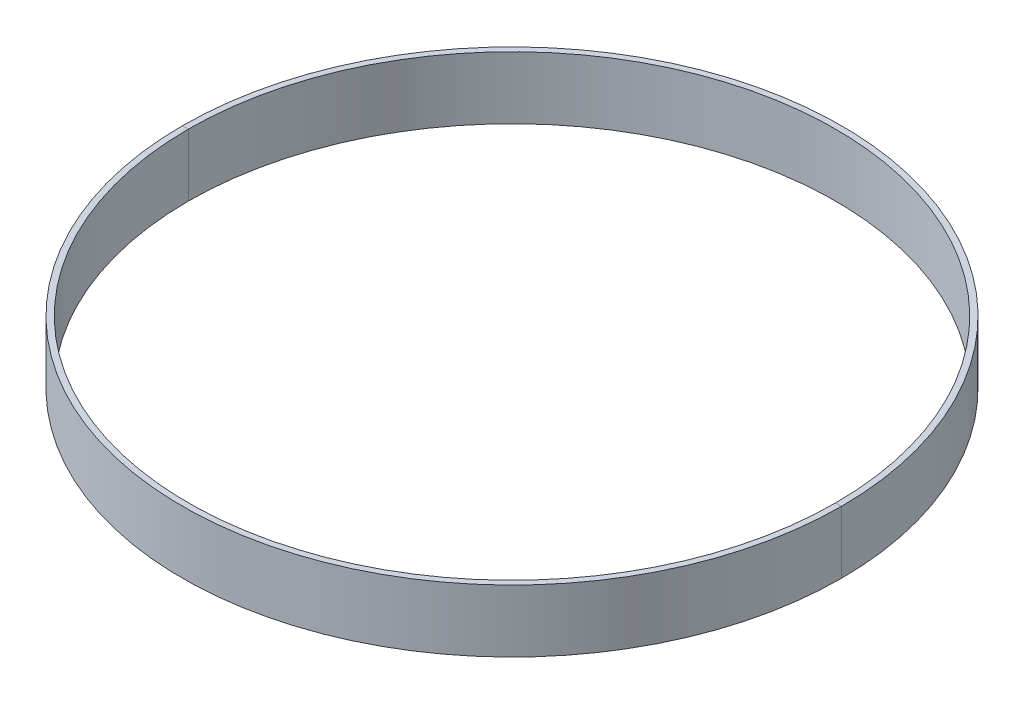
ISO-10303-21;
HEADER;
FILE_DESCRIPTION(('STEP AP214'),'2;1');
FILE_NAME('part.step','',(''),(''),'','','');
FILE_SCHEMA(('AUTOMOTIVE_DESIGN { 1 0 10303 214 1 1 1 1 }'));
ENDSEC;
DATA;
#1=APPLICATION_CONTEXT('core data for automotive mechanical design processes');
#2=APPLICATION_PROTOCOL_DEFINITION('international standard','automotive_design',2000,#1);
#3=PRODUCT_CONTEXT('',#1,'mechanical');
#4=PRODUCT('Part','Part','',(#3));
#5=PRODUCT_RELATED_PRODUCT_CATEGORY('part','',(#4));
#6=PRODUCT_DEFINITION_FORMATION('','',#4);
#7=PRODUCT_DEFINITION_CONTEXT('part definition',#1,'design');
#8=PRODUCT_DEFINITION('design','',#6,#7);
#9=PRODUCT_DEFINITION_SHAPE('','',#8);
#10=(LENGTH_UNIT() NAMED_UNIT(*) SI_UNIT(.MILLI.,.METRE.));
#11=(NAMED_UNIT(*) PLANE_ANGLE_UNIT() SI_UNIT($,.RADIAN.));
#12=(NAMED_UNIT(*) SI_UNIT($,.STERADIAN.) SOLID_ANGLE_UNIT());
#13=UNCERTAINTY_MEASURE_WITH_UNIT(LENGTH_MEASURE(1.E-05),#10,'distance_accuracy_value','');
#14=(GEOMETRIC_REPRESENTATION_CONTEXT(3) GLOBAL_UNCERTAINTY_ASSIGNED_CONTEXT((#13)) GLOBAL_UNIT_ASSIGNED_CONTEXT((#10,
#11,#12)) REPRESENTATION_CONTEXT('',''));
#15=CARTESIAN_POINT('',(0.,0.,0.));
#16=DIRECTION('',(0.,0.,1.));
#17=DIRECTION('',(1.,0.,0.));
#18=AXIS2_PLACEMENT_3D('',#15,#16,#17);
#19=CARTESIAN_POINT('',(0.,0.,0.));
#20=DIRECTION('',(0.,0.,1.));
#21=DIRECTION('',(1.,0.,0.));
#22=AXIS2_PLACEMENT_3D('',#19,#20,#21);
#23=PLANE('',#22);
#24=DIRECTION('',(1.,0.,0.));
#25=VECTOR('',#24,1.);
#26=CARTESIAN_POINT('',(0.,13.25,0.));
#27=LINE('',#26,#25);
#28=CARTESIAN_POINT('',(-140.,13.25,0.));
#29=VERTEX_POINT('',#28);
#30=CARTESIAN_POINT('',(-137.5,13.25,0.));
#31=VERTEX_POINT('',#30);
#32=EDGE_CURVE('E111',#29,#31,#27,.T.);
#33=ORIENTED_EDGE('',*,*,#32,.F.);
#34=DIRECTION('',(0.,-1.,0.));
#35=VECTOR('',#34,1.);
#36=CARTESIAN_POINT('',(-140.,13.25,0.));
#37=LINE('',#36,#35);
#38=CARTESIAN_POINT('',(-140.,-13.25,0.));
#39=VERTEX_POINT('',#38);
#40=EDGE_CURVE('E98',#29,#39,#37,.T.);
#41=ORIENTED_EDGE('',*,*,#40,.T.);
#42=DIRECTION('',(1.,0.,0.));
#43=VECTOR('',#42,1.);
#44=CARTESIAN_POINT('',(0.,-13.25,0.));
#45=LINE('',#44,#43);
#46=CARTESIAN_POINT('',(-137.5,-13.25,0.));
#47=VERTEX_POINT('',#46);
#48=EDGE_CURVE('E88',#39,#47,#45,.T.);
#49=ORIENTED_EDGE('',*,*,#48,.T.);
#50=DIRECTION('',(0.,-1.,0.));
#51=VECTOR('',#50,1.);
#52=CARTESIAN_POINT('',(-137.5,13.25,0.));
#53=LINE('',#52,#51);
#54=EDGE_CURVE('E66',#31,#47,#53,.T.);
#55=ORIENTED_EDGE('',*,*,#54,.F.);
#56=EDGE_LOOP('',(#33,#41,#49,#55));
#57=FACE_BOUND('',#56,.T.);
#58=ADVANCED_FACE('F43',(#57),#23,.T.);
#59=CARTESIAN_POINT('',(137.5,-13.25,0.));
#60=VERTEX_POINT('',#59);
#61=CARTESIAN_POINT('',(140.,-13.25,0.));
#62=VERTEX_POINT('',#61);
#63=EDGE_CURVE('E87',#60,#62,#45,.T.);
#64=ORIENTED_EDGE('',*,*,#63,.T.);
#65=DIRECTION('',(0.,-1.,0.));
#66=VECTOR('',#65,1.);
#67=CARTESIAN_POINT('',(140.,13.25,0.));
#68=LINE('',#67,#66);
#69=CARTESIAN_POINT('',(140.,13.25,0.));
#70=VERTEX_POINT('',#69);
#71=EDGE_CURVE('E97',#62,#70,#68,.F.);
#72=ORIENTED_EDGE('',*,*,#71,.T.);
#73=CARTESIAN_POINT('',(137.5,13.25,0.));
#74=VERTEX_POINT('',#73);
#75=EDGE_CURVE('E109',#74,#70,#27,.T.);
#76=ORIENTED_EDGE('',*,*,#75,.F.);
#77=DIRECTION('',(0.,-1.,0.));
#78=VECTOR('',#77,1.);
#79=CARTESIAN_POINT('',(137.5,13.25,0.));
#80=LINE('',#79,#78);
#81=EDGE_CURVE('E58',#60,#74,#80,.F.);
#82=ORIENTED_EDGE('',*,*,#81,.F.);
#83=EDGE_LOOP('',(#64,#72,#76,#82));
#84=FACE_BOUND('',#83,.T.);
#85=ADVANCED_FACE('F96',(#84),#23,.T.);
#86=CARTESIAN_POINT('',(0.,-13.25,0.));
#87=DIRECTION('',(0.,1.,0.));
#88=DIRECTION('',(0.,0.,1.));
#89=AXIS2_PLACEMENT_3D('',#86,#87,#88);
#90=PLANE('',#89);
#91=ORIENTED_EDGE('',*,*,#48,.F.);
#92=CARTESIAN_POINT('',(0.,-13.25,0.));
#93=DIRECTION('',(0.,1.,0.));
#94=DIRECTION('',(0.,0.,1.));
#95=AXIS2_PLACEMENT_3D('',#92,#93,#94);
#96=CIRCLE('',#95,140.);
#97=EDGE_CURVE('E85',#62,#39,#96,.T.);
#98=ORIENTED_EDGE('',*,*,#97,.F.);
#99=ORIENTED_EDGE('',*,*,#63,.F.);
#100=CARTESIAN_POINT('',(0.,-13.25,0.));
#101=DIRECTION('',(0.,1.,0.));
#102=DIRECTION('',(0.,0.,1.));
#103=AXIS2_PLACEMENT_3D('',#100,#101,#102);
#104=CIRCLE('',#103,137.5);
#105=EDGE_CURVE('E12',#60,#47,#104,.T.);
#106=ORIENTED_EDGE('',*,*,#105,.T.);
#107=EDGE_LOOP('',(#91,#98,#99,#106));
#108=FACE_BOUND('',#107,.T.);
#109=ADVANCED_FACE('F86',(#108),#90,.F.);
#110=CARTESIAN_POINT('',(0.,13.25,0.));
#111=DIRECTION('',(0.,1.,0.));
#112=DIRECTION('',(0.,0.,1.));
#113=AXIS2_PLACEMENT_3D('',#110,#111,#112);
#114=PLANE('',#113);
#115=CARTESIAN_POINT('',(0.,13.25,0.));
#116=DIRECTION('',(0.,1.,0.));
#117=DIRECTION('',(0.,0.,1.));
#118=AXIS2_PLACEMENT_3D('',#115,#116,#117);
#119=CIRCLE('',#118,140.);
#120=EDGE_CURVE('E93',#70,#29,#119,.T.);
#121=ORIENTED_EDGE('',*,*,#120,.T.);
#122=ORIENTED_EDGE('',*,*,#32,.T.);
#123=CARTESIAN_POINT('',(0.,13.25,0.));
#124=DIRECTION('',(0.,1.,0.));
#125=DIRECTION('',(0.,0.,1.));
#126=AXIS2_PLACEMENT_3D('',#123,#124,#125);
#127=CIRCLE('',#126,137.5);
#128=EDGE_CURVE('E51',#74,#31,#127,.T.);
#129=ORIENTED_EDGE('',*,*,#128,.F.);
#130=ORIENTED_EDGE('',*,*,#75,.T.);
#131=EDGE_LOOP('',(#121,#122,#129,#130));
#132=FACE_BOUND('',#131,.T.);
#133=ADVANCED_FACE('F108',(#132),#114,.T.);
#134=CARTESIAN_POINT('',(0.,13.25,0.));
#135=DIRECTION('',(0.,-1.,0.));
#136=DIRECTION('',(0.,0.,-1.));
#137=AXIS2_PLACEMENT_3D('',#134,#135,#136);
#138=CYLINDRICAL_SURFACE('',#137,137.5);
#139=ORIENTED_EDGE('',*,*,#128,.T.);
#140=ORIENTED_EDGE('',*,*,#54,.T.);
#141=ORIENTED_EDGE('',*,*,#105,.F.);
#142=ORIENTED_EDGE('',*,*,#81,.T.);
#143=EDGE_LOOP('',(#139,#140,#141,#142));
#144=FACE_BOUND('',#143,.T.);
#145=ADVANCED_FACE('F45',(#144),#138,.F.);
#146=CARTESIAN_POINT('',(0.,13.25,0.));
#147=DIRECTION('',(0.,-1.,0.));
#148=DIRECTION('',(0.,0.,-1.));
#149=AXIS2_PLACEMENT_3D('',#146,#147,#148);
#150=CYLINDRICAL_SURFACE('',#149,140.);
#151=ORIENTED_EDGE('',*,*,#40,.F.);
#152=ORIENTED_EDGE('',*,*,#120,.F.);
#153=ORIENTED_EDGE('',*,*,#71,.F.);
#154=ORIENTED_EDGE('',*,*,#97,.T.);
#155=EDGE_LOOP('',(#151,#152,#153,#154));
#156=FACE_BOUND('',#155,.T.);
#157=ADVANCED_FACE('F100',(#156),#150,.T.);
#158=CLOSED_SHELL('',(#58,#85,#109,#133,#145,#157));
#159=MANIFOLD_SOLID_BREP('B2',#158);
#160=CARTESIAN_POINT('',(0.,0.,0.));
#161=DIRECTION('',(0.,0.,1.));
#162=DIRECTION('',(1.,0.,0.));
#163=AXIS2_PLACEMENT_3D('',#160,#161,#162);
#164=PLANE('',#163);
#165=DIRECTION('',(1.,0.,0.));
#166=VECTOR('',#165,1.);
#167=CARTESIAN_POINT('',(0.,13.25,0.));
#168=LINE('',#167,#166);
#169=CARTESIAN_POINT('',(-140.,13.25,0.));
#170=VERTEX_POINT('',#169);
#171=CARTESIAN_POINT('',(-137.5,13.25,0.));
#172=VERTEX_POINT('',#171);
#173=EDGE_CURVE('E271',#170,#172,#168,.T.);
#174=ORIENTED_EDGE('',*,*,#173,.T.);
#175=DIRECTION('',(0.,-1.,0.));
#176=VECTOR('',#175,1.);
#177=CARTESIAN_POINT('',(-137.5,13.25,0.));
#178=LINE('',#177,#176);
#179=CARTESIAN_POINT('',(-137.5,-13.25,0.));
#180=VERTEX_POINT('',#179);
#181=EDGE_CURVE('E214',#172,#180,#178,.T.);
#182=ORIENTED_EDGE('',*,*,#181,.T.);
#183=DIRECTION('',(1.,0.,0.));
#184=VECTOR('',#183,1.);
#185=CARTESIAN_POINT('',(0.,-13.25,0.));
#186=LINE('',#185,#184);
#187=CARTESIAN_POINT('',(-140.,-13.25,0.));
#188=VERTEX_POINT('',#187);
#189=EDGE_CURVE('E228',#188,#180,#186,.T.);
#190=ORIENTED_EDGE('',*,*,#189,.F.);
#191=DIRECTION('',(0.,-1.,0.));
#192=VECTOR('',#191,1.);
#193=CARTESIAN_POINT('',(-140.,13.25,0.));
#194=LINE('',#193,#192);
#195=EDGE_CURVE('E209',#170,#188,#194,.T.);
#196=ORIENTED_EDGE('',*,*,#195,.F.);
#197=EDGE_LOOP('',(#174,#182,#190,#196));
#198=FACE_BOUND('',#197,.T.);
#199=ADVANCED_FACE('F206',(#198),#164,.F.);
#200=CARTESIAN_POINT('',(137.5,-13.25,0.));
#201=VERTEX_POINT('',#200);
#202=CARTESIAN_POINT('',(140.,-13.25,0.));
#203=VERTEX_POINT('',#202);
#204=EDGE_CURVE('E252',#201,#203,#186,.T.);
#205=ORIENTED_EDGE('',*,*,#204,.F.);
#206=DIRECTION('',(0.,-1.,0.));
#207=VECTOR('',#206,1.);
#208=CARTESIAN_POINT('',(137.5,13.25,0.));
#209=LINE('',#208,#207);
#210=CARTESIAN_POINT('',(137.5,13.25,0.));
#211=VERTEX_POINT('',#210);
#212=EDGE_CURVE('E41',#201,#211,#209,.F.);
#213=ORIENTED_EDGE('',*,*,#212,.T.);
#214=CARTESIAN_POINT('',(140.,13.25,0.));
#215=VERTEX_POINT('',#214);
#216=EDGE_CURVE('E253',#211,#215,#168,.T.);
#217=ORIENTED_EDGE('',*,*,#216,.T.);
#218=DIRECTION('',(0.,-1.,0.));
#219=VECTOR('',#218,1.);
#220=CARTESIAN_POINT('',(140.,13.25,0.));
#221=LINE('',#220,#219);
#222=EDGE_CURVE('E249',#203,#215,#221,.F.);
#223=ORIENTED_EDGE('',*,*,#222,.F.);
#224=EDGE_LOOP('',(#205,#213,#217,#223));
#225=FACE_BOUND('',#224,.T.);
#226=ADVANCED_FACE('F251',(#225),#164,.F.);
#227=CARTESIAN_POINT('',(0.,13.25,0.));
#228=DIRECTION('',(0.,1.,0.));
#229=DIRECTION('',(0.,0.,1.));
#230=AXIS2_PLACEMENT_3D('',#227,#228,#229);
#231=PLANE('',#230);
#232=ORIENTED_EDGE('',*,*,#173,.F.);
#233=CARTESIAN_POINT('',(0.,13.25,0.));
#234=DIRECTION('',(0.,1.,0.));
#235=DIRECTION('',(0.,0.,1.));
#236=AXIS2_PLACEMENT_3D('',#233,#234,#235);
#237=CIRCLE('',#236,140.);
#238=EDGE_CURVE('E258',#170,#215,#237,.T.);
#239=ORIENTED_EDGE('',*,*,#238,.T.);
#240=ORIENTED_EDGE('',*,*,#216,.F.);
#241=CARTESIAN_POINT('',(0.,13.25,0.));
#242=DIRECTION('',(0.,1.,0.));
#243=DIRECTION('',(0.,0.,1.));
#244=AXIS2_PLACEMENT_3D('',#241,#242,#243);
#245=CIRCLE('',#244,137.5);
#246=EDGE_CURVE('E264',#172,#211,#245,.T.);
#247=ORIENTED_EDGE('',*,*,#246,.F.);
#248=EDGE_LOOP('',(#232,#239,#240,#247));
#249=FACE_BOUND('',#248,.T.);
#250=ADVANCED_FACE('F277',(#249),#231,.T.);
#251=CARTESIAN_POINT('',(0.,-13.25,0.));
#252=DIRECTION('',(0.,1.,0.));
#253=DIRECTION('',(0.,0.,1.));
#254=AXIS2_PLACEMENT_3D('',#251,#252,#253);
#255=PLANE('',#254);
#256=CARTESIAN_POINT('',(0.,-13.25,0.));
#257=DIRECTION('',(0.,1.,0.));
#258=DIRECTION('',(0.,0.,1.));
#259=AXIS2_PLACEMENT_3D('',#256,#257,#258);
#260=CIRCLE('',#259,140.);
#261=EDGE_CURVE('E260',#188,#203,#260,.T.);
#262=ORIENTED_EDGE('',*,*,#261,.F.);
#263=ORIENTED_EDGE('',*,*,#189,.T.);
#264=CARTESIAN_POINT('',(0.,-13.25,0.));
#265=DIRECTION('',(0.,1.,0.));
#266=DIRECTION('',(0.,0.,1.));
#267=AXIS2_PLACEMENT_3D('',#264,#265,#266);
#268=CIRCLE('',#267,137.5);
#269=EDGE_CURVE('E261',#180,#201,#268,.T.);
#270=ORIENTED_EDGE('',*,*,#269,.T.);
#271=ORIENTED_EDGE('',*,*,#204,.T.);
#272=EDGE_LOOP('',(#262,#263,#270,#271));
#273=FACE_BOUND('',#272,.T.);
#274=ADVANCED_FACE('F259',(#273),#255,.F.);
#275=CARTESIAN_POINT('',(0.,13.25,0.));
#276=DIRECTION('',(0.,-1.,0.));
#277=DIRECTION('',(0.,0.,-1.));
#278=AXIS2_PLACEMENT_3D('',#275,#276,#277);
#279=CYLINDRICAL_SURFACE('',#278,140.);
#280=ORIENTED_EDGE('',*,*,#238,.F.);
#281=ORIENTED_EDGE('',*,*,#195,.T.);
#282=ORIENTED_EDGE('',*,*,#261,.T.);
#283=ORIENTED_EDGE('',*,*,#222,.T.);
#284=EDGE_LOOP('',(#280,#281,#282,#283));
#285=FACE_BOUND('',#284,.T.);
#286=ADVANCED_FACE('F263',(#285),#279,.T.);
#287=CARTESIAN_POINT('',(0.,13.25,0.));
#288=DIRECTION('',(0.,-1.,0.));
#289=DIRECTION('',(0.,0.,-1.));
#290=AXIS2_PLACEMENT_3D('',#287,#288,#289);
#291=CYLINDRICAL_SURFACE('',#290,137.5);
#292=ORIENTED_EDGE('',*,*,#181,.F.);
#293=ORIENTED_EDGE('',*,*,#246,.T.);
#294=ORIENTED_EDGE('',*,*,#212,.F.);
#295=ORIENTED_EDGE('',*,*,#269,.F.);
#296=EDGE_LOOP('',(#292,#293,#294,#295));
#297=FACE_BOUND('',#296,.T.);
#298=ADVANCED_FACE('F278',(#297),#291,.F.);
#299=CLOSED_SHELL('',(#199,#226,#250,#274,#286,#298));
#300=MANIFOLD_SOLID_BREP('B6',#299);
#301=ADVANCED_BREP_SHAPE_REPRESENTATION('',(#18,#159,#300),#14);
#302=SHAPE_DEFINITION_REPRESENTATION(#9,#301);
ENDSEC;
END-ISO-10303-21;
